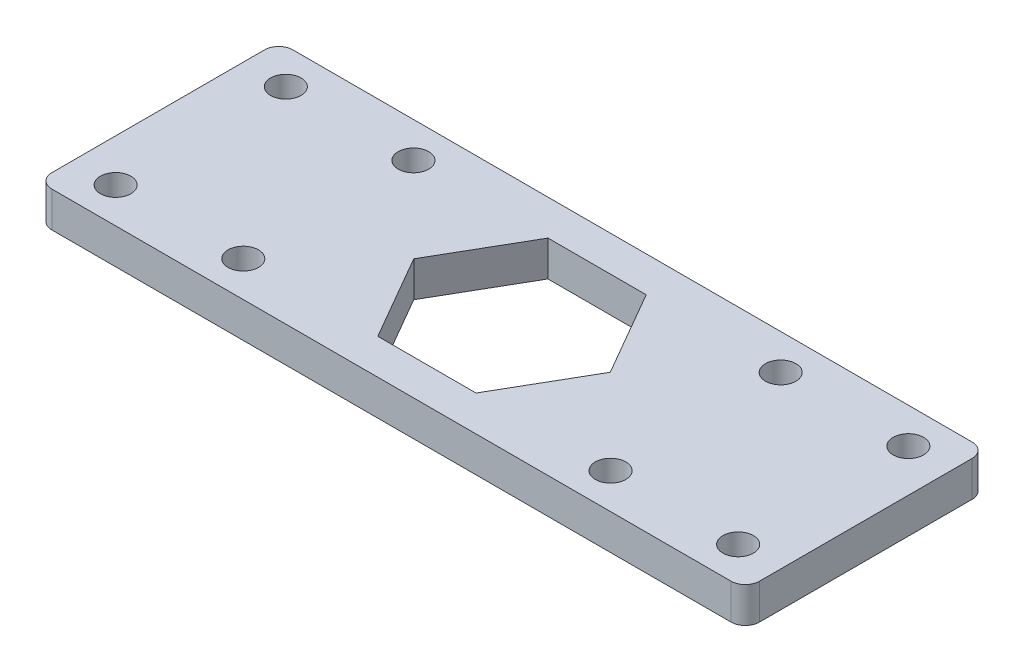
ISO-10303-21;
HEADER;
FILE_DESCRIPTION(('STEP AP214'),'2;1');
FILE_NAME('part.step','',(''),(''),'','','');
FILE_SCHEMA(('AUTOMOTIVE_DESIGN { 1 0 10303 214 1 1 1 1 }'));
ENDSEC;
DATA;
#1=APPLICATION_CONTEXT('core data for automotive mechanical design processes');
#2=APPLICATION_PROTOCOL_DEFINITION('international standard','automotive_design',2000,#1);
#3=PRODUCT_CONTEXT('',#1,'mechanical');
#4=PRODUCT('Part','Part','',(#3));
#5=PRODUCT_RELATED_PRODUCT_CATEGORY('part','',(#4));
#6=PRODUCT_DEFINITION_FORMATION('','',#4);
#7=PRODUCT_DEFINITION_CONTEXT('part definition',#1,'design');
#8=PRODUCT_DEFINITION('design','',#6,#7);
#9=PRODUCT_DEFINITION_SHAPE('','',#8);
#10=(LENGTH_UNIT() NAMED_UNIT(*) SI_UNIT(.MILLI.,.METRE.));
#11=(NAMED_UNIT(*) PLANE_ANGLE_UNIT() SI_UNIT($,.RADIAN.));
#12=(NAMED_UNIT(*) SI_UNIT($,.STERADIAN.) SOLID_ANGLE_UNIT());
#13=UNCERTAINTY_MEASURE_WITH_UNIT(LENGTH_MEASURE(1.E-05),#10,'distance_accuracy_value','');
#14=(GEOMETRIC_REPRESENTATION_CONTEXT(3) GLOBAL_UNCERTAINTY_ASSIGNED_CONTEXT((#13)) GLOBAL_UNIT_ASSIGNED_CONTEXT((#10,
#11,#12)) REPRESENTATION_CONTEXT('',''));
#15=CARTESIAN_POINT('',(0.,0.,0.));
#16=DIRECTION('',(0.,0.,1.));
#17=DIRECTION('',(1.,0.,0.));
#18=AXIS2_PLACEMENT_3D('',#15,#16,#17);
#19=CARTESIAN_POINT('',(-49.9,5.,-17.));
#20=DIRECTION('',(1.,0.,0.));
#21=DIRECTION('',(0.,0.,-1.));
#22=AXIS2_PLACEMENT_3D('',#19,#20,#21);
#23=PLANE('',#22);
#24=DIRECTION('',(0.,0.,1.));
#25=VECTOR('',#24,1.);
#26=CARTESIAN_POINT('',(-49.9,0.,-17.));
#27=LINE('',#26,#25);
#28=CARTESIAN_POINT('',(-49.9,0.,-15.));
#29=VERTEX_POINT('',#28);
#30=CARTESIAN_POINT('',(-49.9,0.,15.));
#31=VERTEX_POINT('',#30);
#32=EDGE_CURVE('E237',#29,#31,#27,.T.);
#33=ORIENTED_EDGE('',*,*,#32,.T.);
#34=DIRECTION('',(0.,-1.,0.));
#35=VECTOR('',#34,1.);
#36=CARTESIAN_POINT('',(-49.9,5.,15.));
#37=LINE('',#36,#35);
#38=CARTESIAN_POINT('',(-49.9,5.,15.));
#39=VERTEX_POINT('',#38);
#40=EDGE_CURVE('E11',#31,#39,#37,.F.);
#41=ORIENTED_EDGE('',*,*,#40,.T.);
#42=DIRECTION('',(0.,0.,1.));
#43=VECTOR('',#42,1.);
#44=CARTESIAN_POINT('',(-49.9,5.,-17.));
#45=LINE('',#44,#43);
#46=CARTESIAN_POINT('',(-49.9,5.,-15.));
#47=VERTEX_POINT('',#46);
#48=EDGE_CURVE('E240',#47,#39,#45,.T.);
#49=ORIENTED_EDGE('',*,*,#48,.F.);
#50=DIRECTION('',(0.,-1.,0.));
#51=VECTOR('',#50,1.);
#52=CARTESIAN_POINT('',(-49.9,5.,-15.));
#53=LINE('',#52,#51);
#54=EDGE_CURVE('E40',#47,#29,#53,.T.);
#55=ORIENTED_EDGE('',*,*,#54,.T.);
#56=EDGE_LOOP('',(#33,#41,#49,#55));
#57=FACE_BOUND('',#56,.T.);
#58=ADVANCED_FACE('F32',(#57),#23,.F.);
#59=CARTESIAN_POINT('',(49.9,5.,17.));
#60=DIRECTION('',(0.,0.,-1.));
#61=DIRECTION('',(-1.,0.,0.));
#62=AXIS2_PLACEMENT_3D('',#59,#60,#61);
#63=PLANE('',#62);
#64=DIRECTION('',(1.,0.,0.));
#65=VECTOR('',#64,1.);
#66=CARTESIAN_POINT('',(49.9,0.,17.));
#67=LINE('',#66,#65);
#68=CARTESIAN_POINT('',(-47.9,0.,17.));
#69=VERTEX_POINT('',#68);
#70=CARTESIAN_POINT('',(47.9,0.,17.));
#71=VERTEX_POINT('',#70);
#72=EDGE_CURVE('E254',#69,#71,#67,.T.);
#73=ORIENTED_EDGE('',*,*,#72,.T.);
#74=DIRECTION('',(0.,-1.,0.));
#75=VECTOR('',#74,1.);
#76=CARTESIAN_POINT('',(47.9,5.,17.));
#77=LINE('',#76,#75);
#78=CARTESIAN_POINT('',(47.9,5.,17.));
#79=VERTEX_POINT('',#78);
#80=EDGE_CURVE('E47',#71,#79,#77,.F.);
#81=ORIENTED_EDGE('',*,*,#80,.T.);
#82=DIRECTION('',(1.,0.,0.));
#83=VECTOR('',#82,1.);
#84=CARTESIAN_POINT('',(49.9,5.,17.));
#85=LINE('',#84,#83);
#86=CARTESIAN_POINT('',(-47.9,5.,17.));
#87=VERTEX_POINT('',#86);
#88=EDGE_CURVE('E242',#87,#79,#85,.T.);
#89=ORIENTED_EDGE('',*,*,#88,.F.);
#90=DIRECTION('',(0.,-1.,0.));
#91=VECTOR('',#90,1.);
#92=CARTESIAN_POINT('',(-47.9,5.,17.));
#93=LINE('',#92,#91);
#94=EDGE_CURVE('E285',#87,#69,#93,.T.);
#95=ORIENTED_EDGE('',*,*,#94,.T.);
#96=EDGE_LOOP('',(#73,#81,#89,#95));
#97=FACE_BOUND('',#96,.T.);
#98=ADVANCED_FACE('F302',(#97),#63,.F.);
#99=CARTESIAN_POINT('',(49.9,5.,-17.));
#100=DIRECTION('',(-1.,0.,0.));
#101=DIRECTION('',(0.,0.,1.));
#102=AXIS2_PLACEMENT_3D('',#99,#100,#101);
#103=PLANE('',#102);
#104=DIRECTION('',(0.,0.,-1.));
#105=VECTOR('',#104,1.);
#106=CARTESIAN_POINT('',(49.9,0.,-17.));
#107=LINE('',#106,#105);
#108=CARTESIAN_POINT('',(49.9,0.,15.));
#109=VERTEX_POINT('',#108);
#110=CARTESIAN_POINT('',(49.9,0.,-15.));
#111=VERTEX_POINT('',#110);
#112=EDGE_CURVE('E256',#109,#111,#107,.T.);
#113=ORIENTED_EDGE('',*,*,#112,.T.);
#114=DIRECTION('',(0.,-1.,0.));
#115=VECTOR('',#114,1.);
#116=CARTESIAN_POINT('',(49.9,5.,-15.));
#117=LINE('',#116,#115);
#118=CARTESIAN_POINT('',(49.9,5.,-15.));
#119=VERTEX_POINT('',#118);
#120=EDGE_CURVE('E276',#111,#119,#117,.F.);
#121=ORIENTED_EDGE('',*,*,#120,.T.);
#122=DIRECTION('',(0.,0.,-1.));
#123=VECTOR('',#122,1.);
#124=CARTESIAN_POINT('',(49.9,5.,-17.));
#125=LINE('',#124,#123);
#126=CARTESIAN_POINT('',(49.9,5.,15.));
#127=VERTEX_POINT('',#126);
#128=EDGE_CURVE('E245',#127,#119,#125,.T.);
#129=ORIENTED_EDGE('',*,*,#128,.F.);
#130=DIRECTION('',(0.,-1.,0.));
#131=VECTOR('',#130,1.);
#132=CARTESIAN_POINT('',(49.9,5.,15.));
#133=LINE('',#132,#131);
#134=EDGE_CURVE('E273',#127,#109,#133,.T.);
#135=ORIENTED_EDGE('',*,*,#134,.T.);
#136=EDGE_LOOP('',(#113,#121,#129,#135));
#137=FACE_BOUND('',#136,.T.);
#138=ADVANCED_FACE('F311',(#137),#103,.F.);
#139=CARTESIAN_POINT('',(49.9,5.,-17.));
#140=DIRECTION('',(0.,0.,1.));
#141=DIRECTION('',(1.,0.,0.));
#142=AXIS2_PLACEMENT_3D('',#139,#140,#141);
#143=PLANE('',#142);
#144=DIRECTION('',(-1.,0.,0.));
#145=VECTOR('',#144,1.);
#146=CARTESIAN_POINT('',(49.9,5.,-17.));
#147=LINE('',#146,#145);
#148=CARTESIAN_POINT('',(47.9,5.,-17.));
#149=VERTEX_POINT('',#148);
#150=CARTESIAN_POINT('',(-47.9,5.,-17.));
#151=VERTEX_POINT('',#150);
#152=EDGE_CURVE('E248',#149,#151,#147,.T.);
#153=ORIENTED_EDGE('',*,*,#152,.F.);
#154=DIRECTION('',(0.,-1.,0.));
#155=VECTOR('',#154,1.);
#156=CARTESIAN_POINT('',(47.9,5.,-17.));
#157=LINE('',#156,#155);
#158=CARTESIAN_POINT('',(47.9,0.,-17.));
#159=VERTEX_POINT('',#158);
#160=EDGE_CURVE('E262',#149,#159,#157,.T.);
#161=ORIENTED_EDGE('',*,*,#160,.T.);
#162=DIRECTION('',(-1.,0.,0.));
#163=VECTOR('',#162,1.);
#164=CARTESIAN_POINT('',(49.9,0.,-17.));
#165=LINE('',#164,#163);
#166=CARTESIAN_POINT('',(-47.9,0.,-17.));
#167=VERTEX_POINT('',#166);
#168=EDGE_CURVE('E243',#159,#167,#165,.T.);
#169=ORIENTED_EDGE('',*,*,#168,.T.);
#170=DIRECTION('',(0.,-1.,0.));
#171=VECTOR('',#170,1.);
#172=CARTESIAN_POINT('',(-47.9,5.,-17.));
#173=LINE('',#172,#171);
#174=EDGE_CURVE('E251',#167,#151,#173,.F.);
#175=ORIENTED_EDGE('',*,*,#174,.T.);
#176=EDGE_LOOP('',(#153,#161,#169,#175));
#177=FACE_BOUND('',#176,.T.);
#178=ADVANCED_FACE('F319',(#177),#143,.F.);
#179=CARTESIAN_POINT('',(0.,5.,0.));
#180=DIRECTION('',(0.,-1.,0.));
#181=DIRECTION('',(0.,0.,-1.));
#182=AXIS2_PLACEMENT_3D('',#179,#180,#181);
#183=PLANE('',#182);
#184=CARTESIAN_POINT('',(43.9,5.,12.));
#185=DIRECTION('',(0.,1.,0.));
#186=DIRECTION('',(0.,0.,-1.));
#187=AXIS2_PLACEMENT_3D('',#184,#185,#186);
#188=CIRCLE('',#187,2.15);
#189=CARTESIAN_POINT('',(43.9,5.,9.84999999999999));
#190=VERTEX_POINT('',#189);
#191=EDGE_CURVE('E200',#190,#190,#188,.T.);
#192=ORIENTED_EDGE('',*,*,#191,.F.);
#193=EDGE_LOOP('',(#192));
#194=FACE_BOUND('',#193,.T.);
#195=CARTESIAN_POINT('',(25.9,5.,-12.));
#196=DIRECTION('',(0.,1.,0.));
#197=DIRECTION('',(0.,0.,-1.));
#198=AXIS2_PLACEMENT_3D('',#195,#196,#197);
#199=CIRCLE('',#198,2.15);
#200=CARTESIAN_POINT('',(25.9,5.,-14.15));
#201=VERTEX_POINT('',#200);
#202=EDGE_CURVE('E206',#201,#201,#199,.T.);
#203=ORIENTED_EDGE('',*,*,#202,.F.);
#204=EDGE_LOOP('',(#203));
#205=FACE_BOUND('',#204,.T.);
#206=CARTESIAN_POINT('',(43.9,5.,-12.));
#207=DIRECTION('',(0.,1.,0.));
#208=DIRECTION('',(0.,0.,-1.));
#209=AXIS2_PLACEMENT_3D('',#206,#207,#208);
#210=CIRCLE('',#209,2.15);
#211=CARTESIAN_POINT('',(43.9,5.,-14.15));
#212=VERTEX_POINT('',#211);
#213=EDGE_CURVE('E166',#212,#212,#210,.T.);
#214=ORIENTED_EDGE('',*,*,#213,.F.);
#215=EDGE_LOOP('',(#214));
#216=FACE_BOUND('',#215,.T.);
#217=DIRECTION('',(0.5,0.,0.866025403784438));
#218=VECTOR('',#217,1.);
#219=CARTESIAN_POINT('',(-13.856406460551,5.,0.));
#220=LINE('',#219,#218);
#221=CARTESIAN_POINT('',(-13.856406460551,5.,0.));
#222=VERTEX_POINT('',#221);
#223=CARTESIAN_POINT('',(-6.92820323027551,5.,12.));
#224=VERTEX_POINT('',#223);
#225=EDGE_CURVE('E177',#222,#224,#220,.T.);
#226=ORIENTED_EDGE('',*,*,#225,.F.);
#227=DIRECTION('',(-0.5,0.,0.866025403784439));
#228=VECTOR('',#227,1.);
#229=CARTESIAN_POINT('',(-6.92820323027551,5.,-12.));
#230=LINE('',#229,#228);
#231=CARTESIAN_POINT('',(-6.92820323027551,5.,-12.));
#232=VERTEX_POINT('',#231);
#233=EDGE_CURVE('E141',#232,#222,#230,.T.);
#234=ORIENTED_EDGE('',*,*,#233,.F.);
#235=DIRECTION('',(-1.,0.,0.));
#236=VECTOR('',#235,1.);
#237=CARTESIAN_POINT('',(6.92820323027552,5.,-12.));
#238=LINE('',#237,#236);
#239=CARTESIAN_POINT('',(6.92820323027552,5.,-12.));
#240=VERTEX_POINT('',#239);
#241=EDGE_CURVE('E160',#240,#232,#238,.T.);
#242=ORIENTED_EDGE('',*,*,#241,.F.);
#243=DIRECTION('',(-0.5,0.,-0.866025403784439));
#244=VECTOR('',#243,1.);
#245=CARTESIAN_POINT('',(13.856406460551,5.,0.));
#246=LINE('',#245,#244);
#247=CARTESIAN_POINT('',(13.856406460551,5.,0.));
#248=VERTEX_POINT('',#247);
#249=EDGE_CURVE('E163',#248,#240,#246,.T.);
#250=ORIENTED_EDGE('',*,*,#249,.F.);
#251=DIRECTION('',(0.5,0.,-0.866025403784439));
#252=VECTOR('',#251,1.);
#253=CARTESIAN_POINT('',(6.92820323027552,5.,12.));
#254=LINE('',#253,#252);
#255=CARTESIAN_POINT('',(6.92820323027552,5.,12.));
#256=VERTEX_POINT('',#255);
#257=EDGE_CURVE('E182',#256,#248,#254,.T.);
#258=ORIENTED_EDGE('',*,*,#257,.F.);
#259=DIRECTION('',(1.,0.,0.));
#260=VECTOR('',#259,1.);
#261=CARTESIAN_POINT('',(-6.92820323027551,5.,12.));
#262=LINE('',#261,#260);
#263=EDGE_CURVE('E179',#224,#256,#262,.T.);
#264=ORIENTED_EDGE('',*,*,#263,.F.);
#265=EDGE_LOOP('',(#226,#234,#242,#250,#258,#264));
#266=FACE_BOUND('',#265,.T.);
#267=CARTESIAN_POINT('',(-25.9,5.,-12.));
#268=DIRECTION('',(0.,1.,0.));
#269=DIRECTION('',(0.,0.,1.));
#270=AXIS2_PLACEMENT_3D('',#267,#268,#269);
#271=CIRCLE('',#270,2.15);
#272=CARTESIAN_POINT('',(-25.9,5.,-9.85));
#273=VERTEX_POINT('',#272);
#274=EDGE_CURVE('E226',#273,#273,#271,.T.);
#275=ORIENTED_EDGE('',*,*,#274,.F.);
#276=EDGE_LOOP('',(#275));
#277=FACE_BOUND('',#276,.T.);
#278=CARTESIAN_POINT('',(-43.9,5.,12.));
#279=DIRECTION('',(0.,1.,0.));
#280=DIRECTION('',(0.,0.,1.));
#281=AXIS2_PLACEMENT_3D('',#278,#279,#280);
#282=CIRCLE('',#281,2.15);
#283=CARTESIAN_POINT('',(-43.9,5.,14.15));
#284=VERTEX_POINT('',#283);
#285=EDGE_CURVE('E213',#284,#284,#282,.T.);
#286=ORIENTED_EDGE('',*,*,#285,.F.);
#287=EDGE_LOOP('',(#286));
#288=FACE_BOUND('',#287,.T.);
#289=CARTESIAN_POINT('',(-25.9,5.,12.));
#290=DIRECTION('',(0.,1.,0.));
#291=DIRECTION('',(0.,0.,1.));
#292=AXIS2_PLACEMENT_3D('',#289,#290,#291);
#293=CIRCLE('',#292,2.15);
#294=CARTESIAN_POINT('',(-25.9,5.,14.15));
#295=VERTEX_POINT('',#294);
#296=EDGE_CURVE('E214',#295,#295,#293,.T.);
#297=ORIENTED_EDGE('',*,*,#296,.F.);
#298=EDGE_LOOP('',(#297));
#299=FACE_BOUND('',#298,.T.);
#300=CARTESIAN_POINT('',(25.9,5.,12.));
#301=DIRECTION('',(0.,1.,0.));
#302=DIRECTION('',(0.,0.,-1.));
#303=AXIS2_PLACEMENT_3D('',#300,#301,#302);
#304=CIRCLE('',#303,2.15);
#305=CARTESIAN_POINT('',(25.9,5.,9.85));
#306=VERTEX_POINT('',#305);
#307=EDGE_CURVE('E199',#306,#306,#304,.T.);
#308=ORIENTED_EDGE('',*,*,#307,.F.);
#309=EDGE_LOOP('',(#308));
#310=FACE_BOUND('',#309,.T.);
#311=CARTESIAN_POINT('',(-43.9,5.,-12.));
#312=DIRECTION('',(0.,1.,0.));
#313=DIRECTION('',(0.,0.,1.));
#314=AXIS2_PLACEMENT_3D('',#311,#312,#313);
#315=CIRCLE('',#314,2.15);
#316=CARTESIAN_POINT('',(-43.9,5.,-9.84999999999999));
#317=VERTEX_POINT('',#316);
#318=EDGE_CURVE('E225',#317,#317,#315,.T.);
#319=ORIENTED_EDGE('',*,*,#318,.F.);
#320=EDGE_LOOP('',(#319));
#321=FACE_BOUND('',#320,.T.);
#322=ORIENTED_EDGE('',*,*,#128,.T.);
#323=CARTESIAN_POINT('',(47.9,5.,-15.));
#324=DIRECTION('',(0.,-1.,0.));
#325=DIRECTION('',(0.,0.,-1.));
#326=AXIS2_PLACEMENT_3D('',#323,#324,#325);
#327=CIRCLE('',#326,2.);
#328=EDGE_CURVE('E283',#119,#149,#327,.F.);
#329=ORIENTED_EDGE('',*,*,#328,.T.);
#330=ORIENTED_EDGE('',*,*,#152,.T.);
#331=CARTESIAN_POINT('',(-47.9,5.,-15.));
#332=DIRECTION('',(0.,-1.,0.));
#333=DIRECTION('',(0.,0.,-1.));
#334=AXIS2_PLACEMENT_3D('',#331,#332,#333);
#335=CIRCLE('',#334,2.);
#336=EDGE_CURVE('E278',#151,#47,#335,.F.);
#337=ORIENTED_EDGE('',*,*,#336,.T.);
#338=ORIENTED_EDGE('',*,*,#48,.T.);
#339=CARTESIAN_POINT('',(-47.9,5.,15.));
#340=DIRECTION('',(0.,-1.,0.));
#341=DIRECTION('',(0.,0.,-1.));
#342=AXIS2_PLACEMENT_3D('',#339,#340,#341);
#343=CIRCLE('',#342,2.);
#344=EDGE_CURVE('E54',#39,#87,#343,.F.);
#345=ORIENTED_EDGE('',*,*,#344,.T.);
#346=ORIENTED_EDGE('',*,*,#88,.T.);
#347=CARTESIAN_POINT('',(47.9,5.,15.));
#348=DIRECTION('',(0.,-1.,0.));
#349=DIRECTION('',(0.,0.,-1.));
#350=AXIS2_PLACEMENT_3D('',#347,#348,#349);
#351=CIRCLE('',#350,2.);
#352=EDGE_CURVE('E281',#79,#127,#351,.F.);
#353=ORIENTED_EDGE('',*,*,#352,.T.);
#354=EDGE_LOOP('',(#322,#329,#330,#337,#338,#345,#346,#353));
#355=FACE_BOUND('',#354,.T.);
#356=ADVANCED_FACE('F304',(#194,#205,#216,#266,#277,#288,#299,#310,#321,#355),#183,.F.);
#357=CARTESIAN_POINT('',(0.,0.,0.));
#358=DIRECTION('',(0.,-1.,0.));
#359=DIRECTION('',(0.,0.,-1.));
#360=AXIS2_PLACEMENT_3D('',#357,#358,#359);
#361=PLANE('',#360);
#362=CARTESIAN_POINT('',(43.9,0.,12.));
#363=DIRECTION('',(0.,1.,0.));
#364=DIRECTION('',(0.,0.,-1.));
#365=AXIS2_PLACEMENT_3D('',#362,#363,#364);
#366=CIRCLE('',#365,2.15);
#367=CARTESIAN_POINT('',(43.9,0.,9.84999999999999));
#368=VERTEX_POINT('',#367);
#369=EDGE_CURVE('E196',#368,#368,#366,.T.);
#370=ORIENTED_EDGE('',*,*,#369,.T.);
#371=EDGE_LOOP('',(#370));
#372=FACE_BOUND('',#371,.T.);
#373=CARTESIAN_POINT('',(25.9,0.,-12.));
#374=DIRECTION('',(0.,1.,0.));
#375=DIRECTION('',(0.,0.,-1.));
#376=AXIS2_PLACEMENT_3D('',#373,#374,#375);
#377=CIRCLE('',#376,2.15);
#378=CARTESIAN_POINT('',(25.9,0.,-14.15));
#379=VERTEX_POINT('',#378);
#380=EDGE_CURVE('E203',#379,#379,#377,.T.);
#381=ORIENTED_EDGE('',*,*,#380,.T.);
#382=EDGE_LOOP('',(#381));
#383=FACE_BOUND('',#382,.T.);
#384=CARTESIAN_POINT('',(43.9,0.,-12.));
#385=DIRECTION('',(0.,1.,0.));
#386=DIRECTION('',(0.,0.,-1.));
#387=AXIS2_PLACEMENT_3D('',#384,#385,#386);
#388=CIRCLE('',#387,2.15);
#389=CARTESIAN_POINT('',(43.9,0.,-14.15));
#390=VERTEX_POINT('',#389);
#391=EDGE_CURVE('E209',#390,#390,#388,.T.);
#392=ORIENTED_EDGE('',*,*,#391,.T.);
#393=EDGE_LOOP('',(#392));
#394=FACE_BOUND('',#393,.T.);
#395=DIRECTION('',(-0.5,0.,0.866025403784439));
#396=VECTOR('',#395,1.);
#397=CARTESIAN_POINT('',(-6.92820323027551,0.,-12.));
#398=LINE('',#397,#396);
#399=CARTESIAN_POINT('',(-6.92820323027551,0.,-12.));
#400=VERTEX_POINT('',#399);
#401=CARTESIAN_POINT('',(-13.856406460551,0.,0.));
#402=VERTEX_POINT('',#401);
#403=EDGE_CURVE('E138',#400,#402,#398,.T.);
#404=ORIENTED_EDGE('',*,*,#403,.T.);
#405=DIRECTION('',(0.5,0.,0.866025403784438));
#406=VECTOR('',#405,1.);
#407=CARTESIAN_POINT('',(-13.856406460551,0.,0.));
#408=LINE('',#407,#406);
#409=CARTESIAN_POINT('',(-6.92820323027551,0.,12.));
#410=VERTEX_POINT('',#409);
#411=EDGE_CURVE('E150',#402,#410,#408,.T.);
#412=ORIENTED_EDGE('',*,*,#411,.T.);
#413=DIRECTION('',(1.,0.,0.));
#414=VECTOR('',#413,1.);
#415=CARTESIAN_POINT('',(-6.92820323027551,0.,12.));
#416=LINE('',#415,#414);
#417=CARTESIAN_POINT('',(6.92820323027552,0.,12.));
#418=VERTEX_POINT('',#417);
#419=EDGE_CURVE('E154',#410,#418,#416,.T.);
#420=ORIENTED_EDGE('',*,*,#419,.T.);
#421=DIRECTION('',(0.5,0.,-0.866025403784439));
#422=VECTOR('',#421,1.);
#423=CARTESIAN_POINT('',(6.92820323027552,0.,12.));
#424=LINE('',#423,#422);
#425=CARTESIAN_POINT('',(13.856406460551,0.,0.));
#426=VERTEX_POINT('',#425);
#427=EDGE_CURVE('E170',#418,#426,#424,.T.);
#428=ORIENTED_EDGE('',*,*,#427,.T.);
#429=DIRECTION('',(-0.5,0.,-0.866025403784439));
#430=VECTOR('',#429,1.);
#431=CARTESIAN_POINT('',(13.856406460551,0.,0.));
#432=LINE('',#431,#430);
#433=CARTESIAN_POINT('',(6.92820323027552,0.,-12.));
#434=VERTEX_POINT('',#433);
#435=EDGE_CURVE('E173',#426,#434,#432,.T.);
#436=ORIENTED_EDGE('',*,*,#435,.T.);
#437=DIRECTION('',(-1.,0.,0.));
#438=VECTOR('',#437,1.);
#439=CARTESIAN_POINT('',(6.92820323027552,0.,-12.));
#440=LINE('',#439,#438);
#441=EDGE_CURVE('E146',#434,#400,#440,.T.);
#442=ORIENTED_EDGE('',*,*,#441,.T.);
#443=EDGE_LOOP('',(#404,#412,#420,#428,#436,#442));
#444=FACE_BOUND('',#443,.T.);
#445=CARTESIAN_POINT('',(-25.9,0.,-12.));
#446=DIRECTION('',(0.,1.,0.));
#447=DIRECTION('',(0.,0.,1.));
#448=AXIS2_PLACEMENT_3D('',#445,#446,#447);
#449=CIRCLE('',#448,2.15);
#450=CARTESIAN_POINT('',(-25.9,0.,-9.85));
#451=VERTEX_POINT('',#450);
#452=EDGE_CURVE('E222',#451,#451,#449,.T.);
#453=ORIENTED_EDGE('',*,*,#452,.T.);
#454=EDGE_LOOP('',(#453));
#455=FACE_BOUND('',#454,.T.);
#456=CARTESIAN_POINT('',(-43.9,0.,12.));
#457=DIRECTION('',(0.,1.,0.));
#458=DIRECTION('',(0.,0.,1.));
#459=AXIS2_PLACEMENT_3D('',#456,#457,#458);
#460=CIRCLE('',#459,2.15);
#461=CARTESIAN_POINT('',(-43.9,0.,14.15));
#462=VERTEX_POINT('',#461);
#463=EDGE_CURVE('E229',#462,#462,#460,.T.);
#464=ORIENTED_EDGE('',*,*,#463,.T.);
#465=EDGE_LOOP('',(#464));
#466=FACE_BOUND('',#465,.T.);
#467=CARTESIAN_POINT('',(-25.9,0.,12.));
#468=DIRECTION('',(0.,1.,0.));
#469=DIRECTION('',(0.,0.,1.));
#470=AXIS2_PLACEMENT_3D('',#467,#468,#469);
#471=CIRCLE('',#470,2.15);
#472=CARTESIAN_POINT('',(-25.9,0.,14.15));
#473=VERTEX_POINT('',#472);
#474=EDGE_CURVE('E210',#473,#473,#471,.T.);
#475=ORIENTED_EDGE('',*,*,#474,.T.);
#476=EDGE_LOOP('',(#475));
#477=FACE_BOUND('',#476,.T.);
#478=CARTESIAN_POINT('',(25.9,0.,12.));
#479=DIRECTION('',(0.,1.,0.));
#480=DIRECTION('',(0.,0.,-1.));
#481=AXIS2_PLACEMENT_3D('',#478,#479,#480);
#482=CIRCLE('',#481,2.15);
#483=CARTESIAN_POINT('',(25.9,0.,9.85));
#484=VERTEX_POINT('',#483);
#485=EDGE_CURVE('E217',#484,#484,#482,.T.);
#486=ORIENTED_EDGE('',*,*,#485,.T.);
#487=EDGE_LOOP('',(#486));
#488=FACE_BOUND('',#487,.T.);
#489=CARTESIAN_POINT('',(-43.9,0.,-12.));
#490=DIRECTION('',(0.,1.,0.));
#491=DIRECTION('',(0.,0.,1.));
#492=AXIS2_PLACEMENT_3D('',#489,#490,#491);
#493=CIRCLE('',#492,2.15);
#494=CARTESIAN_POINT('',(-43.9,0.,-9.84999999999999));
#495=VERTEX_POINT('',#494);
#496=EDGE_CURVE('E234',#495,#495,#493,.T.);
#497=ORIENTED_EDGE('',*,*,#496,.T.);
#498=EDGE_LOOP('',(#497));
#499=FACE_BOUND('',#498,.T.);
#500=ORIENTED_EDGE('',*,*,#168,.F.);
#501=CARTESIAN_POINT('',(47.9,0.,-15.));
#502=DIRECTION('',(0.,-1.,0.));
#503=DIRECTION('',(0.,0.,-1.));
#504=AXIS2_PLACEMENT_3D('',#501,#502,#503);
#505=CIRCLE('',#504,2.);
#506=EDGE_CURVE('E271',#159,#111,#505,.T.);
#507=ORIENTED_EDGE('',*,*,#506,.T.);
#508=ORIENTED_EDGE('',*,*,#112,.F.);
#509=CARTESIAN_POINT('',(47.9,0.,15.));
#510=DIRECTION('',(0.,-1.,0.));
#511=DIRECTION('',(0.,0.,-1.));
#512=AXIS2_PLACEMENT_3D('',#509,#510,#511);
#513=CIRCLE('',#512,2.);
#514=EDGE_CURVE('E269',#109,#71,#513,.T.);
#515=ORIENTED_EDGE('',*,*,#514,.T.);
#516=ORIENTED_EDGE('',*,*,#72,.F.);
#517=CARTESIAN_POINT('',(-47.9,0.,15.));
#518=DIRECTION('',(0.,-1.,0.));
#519=DIRECTION('',(0.,0.,-1.));
#520=AXIS2_PLACEMENT_3D('',#517,#518,#519);
#521=CIRCLE('',#520,2.);
#522=EDGE_CURVE('E267',#69,#31,#521,.T.);
#523=ORIENTED_EDGE('',*,*,#522,.T.);
#524=ORIENTED_EDGE('',*,*,#32,.F.);
#525=CARTESIAN_POINT('',(-47.9,0.,-15.));
#526=DIRECTION('',(0.,-1.,0.));
#527=DIRECTION('',(0.,0.,-1.));
#528=AXIS2_PLACEMENT_3D('',#525,#526,#527);
#529=CIRCLE('',#528,2.);
#530=EDGE_CURVE('E265',#29,#167,#529,.T.);
#531=ORIENTED_EDGE('',*,*,#530,.T.);
#532=EDGE_LOOP('',(#500,#507,#508,#515,#516,#523,#524,#531));
#533=FACE_BOUND('',#532,.T.);
#534=ADVANCED_FACE('F156',(#372,#383,#394,#444,#455,#466,#477,#488,#499,#533),#361,.T.);
#535=CARTESIAN_POINT('',(-43.9,0.,-12.));
#536=DIRECTION('',(0.,1.,0.));
#537=DIRECTION('',(0.,0.,1.));
#538=AXIS2_PLACEMENT_3D('',#535,#536,#537);
#539=CYLINDRICAL_SURFACE('',#538,2.15);
#540=ORIENTED_EDGE('',*,*,#496,.F.);
#541=EDGE_LOOP('',(#540));
#542=FACE_BOUND('',#541,.T.);
#543=ORIENTED_EDGE('',*,*,#318,.T.);
#544=EDGE_LOOP('',(#543));
#545=FACE_BOUND('',#544,.T.);
#546=ADVANCED_FACE('F470',(#542,#545),#539,.F.);
#547=CARTESIAN_POINT('',(25.9,0.,12.));
#548=DIRECTION('',(0.,1.,0.));
#549=DIRECTION('',(0.,0.,1.));
#550=AXIS2_PLACEMENT_3D('',#547,#548,#549);
#551=CYLINDRICAL_SURFACE('',#550,2.15);
#552=ORIENTED_EDGE('',*,*,#485,.F.);
#553=EDGE_LOOP('',(#552));
#554=FACE_BOUND('',#553,.T.);
#555=ORIENTED_EDGE('',*,*,#307,.T.);
#556=EDGE_LOOP('',(#555));
#557=FACE_BOUND('',#556,.T.);
#558=ADVANCED_FACE('F461',(#554,#557),#551,.F.);
#559=CARTESIAN_POINT('',(-25.9,0.,12.));
#560=DIRECTION('',(0.,1.,0.));
#561=DIRECTION('',(0.,0.,1.));
#562=AXIS2_PLACEMENT_3D('',#559,#560,#561);
#563=CYLINDRICAL_SURFACE('',#562,2.15);
#564=ORIENTED_EDGE('',*,*,#474,.F.);
#565=EDGE_LOOP('',(#564));
#566=FACE_BOUND('',#565,.T.);
#567=ORIENTED_EDGE('',*,*,#296,.T.);
#568=EDGE_LOOP('',(#567));
#569=FACE_BOUND('',#568,.T.);
#570=ADVANCED_FACE('F452',(#566,#569),#563,.F.);
#571=CARTESIAN_POINT('',(-43.9,0.,12.));
#572=DIRECTION('',(0.,1.,0.));
#573=DIRECTION('',(0.,0.,1.));
#574=AXIS2_PLACEMENT_3D('',#571,#572,#573);
#575=CYLINDRICAL_SURFACE('',#574,2.15);
#576=ORIENTED_EDGE('',*,*,#463,.F.);
#577=EDGE_LOOP('',(#576));
#578=FACE_BOUND('',#577,.T.);
#579=ORIENTED_EDGE('',*,*,#285,.T.);
#580=EDGE_LOOP('',(#579));
#581=FACE_BOUND('',#580,.T.);
#582=ADVANCED_FACE('F443',(#578,#581),#575,.F.);
#583=CARTESIAN_POINT('',(-25.9,0.,-12.));
#584=DIRECTION('',(0.,1.,0.));
#585=DIRECTION('',(0.,0.,1.));
#586=AXIS2_PLACEMENT_3D('',#583,#584,#585);
#587=CYLINDRICAL_SURFACE('',#586,2.15);
#588=ORIENTED_EDGE('',*,*,#452,.F.);
#589=EDGE_LOOP('',(#588));
#590=FACE_BOUND('',#589,.T.);
#591=ORIENTED_EDGE('',*,*,#274,.T.);
#592=EDGE_LOOP('',(#591));
#593=FACE_BOUND('',#592,.T.);
#594=ADVANCED_FACE('F435',(#590,#593),#587,.F.);
#595=CARTESIAN_POINT('',(-6.92820323027551,0.,-12.));
#596=DIRECTION('',(-0.866025403784439,0.,-0.5));
#597=DIRECTION('',(-0.5,0.,0.866025403784439));
#598=AXIS2_PLACEMENT_3D('',#595,#596,#597);
#599=PLANE('',#598);
#600=ORIENTED_EDGE('',*,*,#233,.T.);
#601=DIRECTION('',(0.,1.,0.));
#602=VECTOR('',#601,1.);
#603=CARTESIAN_POINT('',(-13.856406460551,0.,0.));
#604=LINE('',#603,#602);
#605=EDGE_CURVE('E134',#402,#222,#604,.T.);
#606=ORIENTED_EDGE('',*,*,#605,.F.);
#607=ORIENTED_EDGE('',*,*,#403,.F.);
#608=DIRECTION('',(0.,1.,0.));
#609=VECTOR('',#608,1.);
#610=CARTESIAN_POINT('',(-6.92820323027551,0.,-12.));
#611=LINE('',#610,#609);
#612=EDGE_CURVE('E187',#400,#232,#611,.T.);
#613=ORIENTED_EDGE('',*,*,#612,.T.);
#614=EDGE_LOOP('',(#600,#606,#607,#613));
#615=FACE_BOUND('',#614,.T.);
#616=ADVANCED_FACE('F136',(#615),#599,.F.);
#617=CARTESIAN_POINT('',(6.92820323027552,0.,-12.));
#618=DIRECTION('',(0.,0.,-1.));
#619=DIRECTION('',(-1.,0.,0.));
#620=AXIS2_PLACEMENT_3D('',#617,#618,#619);
#621=PLANE('',#620);
#622=ORIENTED_EDGE('',*,*,#241,.T.);
#623=ORIENTED_EDGE('',*,*,#612,.F.);
#624=ORIENTED_EDGE('',*,*,#441,.F.);
#625=DIRECTION('',(0.,1.,0.));
#626=VECTOR('',#625,1.);
#627=CARTESIAN_POINT('',(6.92820323027552,0.,-12.));
#628=LINE('',#627,#626);
#629=EDGE_CURVE('E189',#434,#240,#628,.T.);
#630=ORIENTED_EDGE('',*,*,#629,.T.);
#631=EDGE_LOOP('',(#622,#623,#624,#630));
#632=FACE_BOUND('',#631,.T.);
#633=ADVANCED_FACE('F418',(#632),#621,.F.);
#634=CARTESIAN_POINT('',(13.856406460551,0.,0.));
#635=DIRECTION('',(0.866025403784439,0.,-0.5));
#636=DIRECTION('',(-0.5,0.,-0.866025403784439));
#637=AXIS2_PLACEMENT_3D('',#634,#635,#636);
#638=PLANE('',#637);
#639=ORIENTED_EDGE('',*,*,#249,.T.);
#640=ORIENTED_EDGE('',*,*,#629,.F.);
#641=ORIENTED_EDGE('',*,*,#435,.F.);
#642=DIRECTION('',(0.,1.,0.));
#643=VECTOR('',#642,1.);
#644=CARTESIAN_POINT('',(13.856406460551,0.,0.));
#645=LINE('',#644,#643);
#646=EDGE_CURVE('E191',#426,#248,#645,.T.);
#647=ORIENTED_EDGE('',*,*,#646,.T.);
#648=EDGE_LOOP('',(#639,#640,#641,#647));
#649=FACE_BOUND('',#648,.T.);
#650=ADVANCED_FACE('F409',(#649),#638,.F.);
#651=CARTESIAN_POINT('',(6.92820323027552,0.,12.));
#652=DIRECTION('',(0.866025403784439,0.,0.5));
#653=DIRECTION('',(0.5,0.,-0.866025403784439));
#654=AXIS2_PLACEMENT_3D('',#651,#652,#653);
#655=PLANE('',#654);
#656=ORIENTED_EDGE('',*,*,#257,.T.);
#657=ORIENTED_EDGE('',*,*,#646,.F.);
#658=ORIENTED_EDGE('',*,*,#427,.F.);
#659=DIRECTION('',(0.,1.,0.));
#660=VECTOR('',#659,1.);
#661=CARTESIAN_POINT('',(6.92820323027552,0.,12.));
#662=LINE('',#661,#660);
#663=EDGE_CURVE('E193',#418,#256,#662,.T.);
#664=ORIENTED_EDGE('',*,*,#663,.T.);
#665=EDGE_LOOP('',(#656,#657,#658,#664));
#666=FACE_BOUND('',#665,.T.);
#667=ADVANCED_FACE('F400',(#666),#655,.F.);
#668=CARTESIAN_POINT('',(-6.92820323027551,0.,12.));
#669=DIRECTION('',(0.,0.,1.));
#670=DIRECTION('',(1.,0.,0.));
#671=AXIS2_PLACEMENT_3D('',#668,#669,#670);
#672=PLANE('',#671);
#673=ORIENTED_EDGE('',*,*,#263,.T.);
#674=ORIENTED_EDGE('',*,*,#663,.F.);
#675=ORIENTED_EDGE('',*,*,#419,.F.);
#676=DIRECTION('',(0.,1.,0.));
#677=VECTOR('',#676,1.);
#678=CARTESIAN_POINT('',(-6.92820323027551,0.,12.));
#679=LINE('',#678,#677);
#680=EDGE_CURVE('E145',#410,#224,#679,.T.);
#681=ORIENTED_EDGE('',*,*,#680,.T.);
#682=EDGE_LOOP('',(#673,#674,#675,#681));
#683=FACE_BOUND('',#682,.T.);
#684=ADVANCED_FACE('F392',(#683),#672,.F.);
#685=CARTESIAN_POINT('',(-13.856406460551,0.,0.));
#686=DIRECTION('',(-0.866025403784439,0.,0.5));
#687=DIRECTION('',(0.5,0.,0.866025403784439));
#688=AXIS2_PLACEMENT_3D('',#685,#686,#687);
#689=PLANE('',#688);
#690=ORIENTED_EDGE('',*,*,#225,.T.);
#691=ORIENTED_EDGE('',*,*,#680,.F.);
#692=ORIENTED_EDGE('',*,*,#411,.F.);
#693=ORIENTED_EDGE('',*,*,#605,.T.);
#694=EDGE_LOOP('',(#690,#691,#692,#693));
#695=FACE_BOUND('',#694,.T.);
#696=ADVANCED_FACE('F151',(#695),#689,.F.);
#697=CARTESIAN_POINT('',(43.9,0.,-12.));
#698=DIRECTION('',(0.,1.,0.));
#699=DIRECTION('',(0.,0.,1.));
#700=AXIS2_PLACEMENT_3D('',#697,#698,#699);
#701=CYLINDRICAL_SURFACE('',#700,2.15);
#702=ORIENTED_EDGE('',*,*,#391,.F.);
#703=EDGE_LOOP('',(#702));
#704=FACE_BOUND('',#703,.T.);
#705=ORIENTED_EDGE('',*,*,#213,.T.);
#706=EDGE_LOOP('',(#705));
#707=FACE_BOUND('',#706,.T.);
#708=ADVANCED_FACE('F375',(#704,#707),#701,.F.);
#709=CARTESIAN_POINT('',(25.9,0.,-12.));
#710=DIRECTION('',(0.,1.,0.));
#711=DIRECTION('',(0.,0.,1.));
#712=AXIS2_PLACEMENT_3D('',#709,#710,#711);
#713=CYLINDRICAL_SURFACE('',#712,2.15);
#714=ORIENTED_EDGE('',*,*,#380,.F.);
#715=EDGE_LOOP('',(#714));
#716=FACE_BOUND('',#715,.T.);
#717=ORIENTED_EDGE('',*,*,#202,.T.);
#718=EDGE_LOOP('',(#717));
#719=FACE_BOUND('',#718,.T.);
#720=ADVANCED_FACE('F366',(#716,#719),#713,.F.);
#721=CARTESIAN_POINT('',(43.9,0.,12.));
#722=DIRECTION('',(0.,1.,0.));
#723=DIRECTION('',(0.,0.,1.));
#724=AXIS2_PLACEMENT_3D('',#721,#722,#723);
#725=CYLINDRICAL_SURFACE('',#724,2.15);
#726=ORIENTED_EDGE('',*,*,#369,.F.);
#727=EDGE_LOOP('',(#726));
#728=FACE_BOUND('',#727,.T.);
#729=ORIENTED_EDGE('',*,*,#191,.T.);
#730=EDGE_LOOP('',(#729));
#731=FACE_BOUND('',#730,.T.);
#732=ADVANCED_FACE('F335',(#728,#731),#725,.F.);
#733=CARTESIAN_POINT('',(47.9,5.,-15.));
#734=DIRECTION('',(0.,-1.,0.));
#735=DIRECTION('',(0.,0.,-1.));
#736=AXIS2_PLACEMENT_3D('',#733,#734,#735);
#737=CYLINDRICAL_SURFACE('',#736,2.);
#738=ORIENTED_EDGE('',*,*,#328,.F.);
#739=ORIENTED_EDGE('',*,*,#120,.F.);
#740=ORIENTED_EDGE('',*,*,#506,.F.);
#741=ORIENTED_EDGE('',*,*,#160,.F.);
#742=EDGE_LOOP('',(#738,#739,#740,#741));
#743=FACE_BOUND('',#742,.T.);
#744=ADVANCED_FACE('F316',(#743),#737,.T.);
#745=CARTESIAN_POINT('',(47.9,5.,15.));
#746=DIRECTION('',(0.,-1.,0.));
#747=DIRECTION('',(0.,0.,-1.));
#748=AXIS2_PLACEMENT_3D('',#745,#746,#747);
#749=CYLINDRICAL_SURFACE('',#748,2.);
#750=ORIENTED_EDGE('',*,*,#352,.F.);
#751=ORIENTED_EDGE('',*,*,#80,.F.);
#752=ORIENTED_EDGE('',*,*,#514,.F.);
#753=ORIENTED_EDGE('',*,*,#134,.F.);
#754=EDGE_LOOP('',(#750,#751,#752,#753));
#755=FACE_BOUND('',#754,.T.);
#756=ADVANCED_FACE('F308',(#755),#749,.T.);
#757=CARTESIAN_POINT('',(-47.9,5.,15.));
#758=DIRECTION('',(0.,-1.,0.));
#759=DIRECTION('',(0.,0.,-1.));
#760=AXIS2_PLACEMENT_3D('',#757,#758,#759);
#761=CYLINDRICAL_SURFACE('',#760,2.);
#762=ORIENTED_EDGE('',*,*,#344,.F.);
#763=ORIENTED_EDGE('',*,*,#40,.F.);
#764=ORIENTED_EDGE('',*,*,#522,.F.);
#765=ORIENTED_EDGE('',*,*,#94,.F.);
#766=EDGE_LOOP('',(#762,#763,#764,#765));
#767=FACE_BOUND('',#766,.T.);
#768=ADVANCED_FACE('F301',(#767),#761,.T.);
#769=CARTESIAN_POINT('',(-47.9,5.,-15.));
#770=DIRECTION('',(0.,-1.,0.));
#771=DIRECTION('',(0.,0.,-1.));
#772=AXIS2_PLACEMENT_3D('',#769,#770,#771);
#773=CYLINDRICAL_SURFACE('',#772,2.);
#774=ORIENTED_EDGE('',*,*,#336,.F.);
#775=ORIENTED_EDGE('',*,*,#174,.F.);
#776=ORIENTED_EDGE('',*,*,#530,.F.);
#777=ORIENTED_EDGE('',*,*,#54,.F.);
#778=EDGE_LOOP('',(#774,#775,#776,#777));
#779=FACE_BOUND('',#778,.T.);
#780=ADVANCED_FACE('F34',(#779),#773,.T.);
#781=CLOSED_SHELL('',(#58,#98,#138,#178,#356,#534,#546,#558,#570,#582,#594,#616,#633,#650,#667,
#684,#696,#708,#720,#732,#744,#756,#768,#780));
#782=MANIFOLD_SOLID_BREP('B2',#781);
#783=ADVANCED_BREP_SHAPE_REPRESENTATION('',(#18,#782),#14);
#784=SHAPE_DEFINITION_REPRESENTATION(#9,#783);
ENDSEC;
END-ISO-10303-21;
